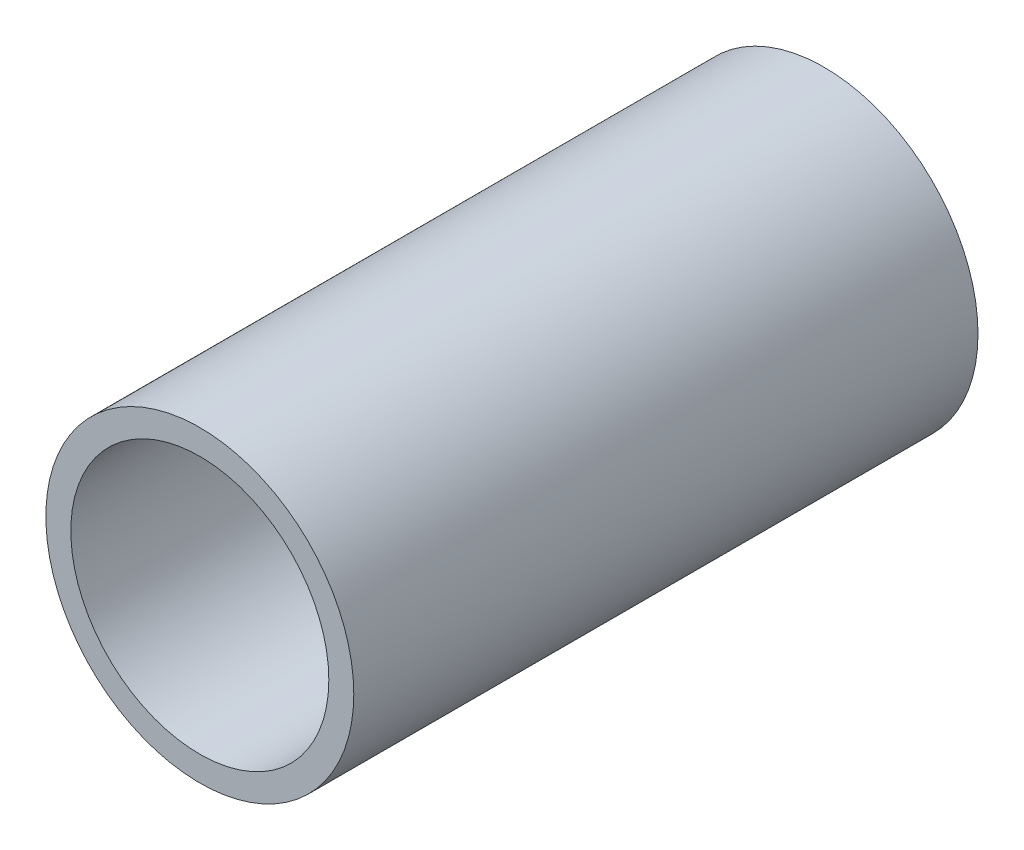
ISO-10303-21;
HEADER;
FILE_DESCRIPTION(('STEP AP214'),'2;1');
FILE_NAME('part.step','',(''),(''),'','','');
FILE_SCHEMA(('AUTOMOTIVE_DESIGN { 1 0 10303 214 1 1 1 1 }'));
ENDSEC;
DATA;
#1=APPLICATION_CONTEXT('core data for automotive mechanical design processes');
#2=APPLICATION_PROTOCOL_DEFINITION('international standard','automotive_design',2000,#1);
#3=PRODUCT_CONTEXT('',#1,'mechanical');
#4=PRODUCT('Part','Part','',(#3));
#5=PRODUCT_RELATED_PRODUCT_CATEGORY('part','',(#4));
#6=PRODUCT_DEFINITION_FORMATION('','',#4);
#7=PRODUCT_DEFINITION_CONTEXT('part definition',#1,'design');
#8=PRODUCT_DEFINITION('design','',#6,#7);
#9=PRODUCT_DEFINITION_SHAPE('','',#8);
#10=(LENGTH_UNIT() NAMED_UNIT(*) SI_UNIT(.MILLI.,.METRE.));
#11=(NAMED_UNIT(*) PLANE_ANGLE_UNIT() SI_UNIT($,.RADIAN.));
#12=(NAMED_UNIT(*) SI_UNIT($,.STERADIAN.) SOLID_ANGLE_UNIT());
#13=UNCERTAINTY_MEASURE_WITH_UNIT(LENGTH_MEASURE(1.E-05),#10,'distance_accuracy_value','');
#14=(GEOMETRIC_REPRESENTATION_CONTEXT(3) GLOBAL_UNCERTAINTY_ASSIGNED_CONTEXT((#13)) GLOBAL_UNIT_ASSIGNED_CONTEXT((#10,
#11,#12)) REPRESENTATION_CONTEXT('',''));
#15=CARTESIAN_POINT('',(0.,0.,0.));
#16=DIRECTION('',(0.,0.,1.));
#17=DIRECTION('',(1.,0.,0.));
#18=AXIS2_PLACEMENT_3D('',#15,#16,#17);
#19=CARTESIAN_POINT('',(0.,0.,15.));
#20=DIRECTION('',(0.,0.,1.));
#21=DIRECTION('',(1.,0.,0.));
#22=AXIS2_PLACEMENT_3D('',#19,#20,#21);
#23=PLANE('',#22);
#24=CARTESIAN_POINT('',(0.,0.,15.));
#25=DIRECTION('',(0.,0.,1.));
#26=DIRECTION('',(1.,0.,0.));
#27=AXIS2_PLACEMENT_3D('',#24,#25,#26);
#28=CIRCLE('',#27,3.7);
#29=CARTESIAN_POINT('',(3.7,0.,15.));
#30=VERTEX_POINT('',#29);
#31=EDGE_CURVE('E10',#30,#30,#28,.T.);
#32=ORIENTED_EDGE('',*,*,#31,.T.);
#33=EDGE_LOOP('',(#32));
#34=FACE_BOUND('',#33,.T.);
#35=CARTESIAN_POINT('',(0.,0.,15.));
#36=DIRECTION('',(0.,0.,1.));
#37=DIRECTION('',(1.,0.,0.));
#38=AXIS2_PLACEMENT_3D('',#35,#36,#37);
#39=CIRCLE('',#38,3.1);
#40=CARTESIAN_POINT('',(3.1,0.,15.));
#41=VERTEX_POINT('',#40);
#42=EDGE_CURVE('E46',#41,#41,#39,.T.);
#43=ORIENTED_EDGE('',*,*,#42,.F.);
#44=EDGE_LOOP('',(#43));
#45=FACE_BOUND('',#44,.T.);
#46=ADVANCED_FACE('F35',(#34,#45),#23,.T.);
#47=CARTESIAN_POINT('',(0.,0.,0.));
#48=DIRECTION('',(0.,0.,1.));
#49=DIRECTION('',(1.,0.,0.));
#50=AXIS2_PLACEMENT_3D('',#47,#48,#49);
#51=PLANE('',#50);
#52=CARTESIAN_POINT('',(0.,0.,0.));
#53=DIRECTION('',(0.,0.,1.));
#54=DIRECTION('',(1.,0.,0.));
#55=AXIS2_PLACEMENT_3D('',#52,#53,#54);
#56=CIRCLE('',#55,3.7);
#57=CARTESIAN_POINT('',(3.7,0.,0.));
#58=VERTEX_POINT('',#57);
#59=EDGE_CURVE('E39',#58,#58,#56,.T.);
#60=ORIENTED_EDGE('',*,*,#59,.F.);
#61=EDGE_LOOP('',(#60));
#62=FACE_BOUND('',#61,.T.);
#63=CARTESIAN_POINT('',(0.,0.,0.));
#64=DIRECTION('',(0.,0.,1.));
#65=DIRECTION('',(1.,0.,0.));
#66=AXIS2_PLACEMENT_3D('',#63,#64,#65);
#67=CIRCLE('',#66,3.1);
#68=CARTESIAN_POINT('',(3.1,0.,0.));
#69=VERTEX_POINT('',#68);
#70=EDGE_CURVE('E48',#69,#69,#67,.T.);
#71=ORIENTED_EDGE('',*,*,#70,.T.);
#72=EDGE_LOOP('',(#71));
#73=FACE_BOUND('',#72,.T.);
#74=ADVANCED_FACE('F58',(#62,#73),#51,.F.);
#75=CARTESIAN_POINT('',(0.,0.,15.));
#76=DIRECTION('',(0.,0.,-1.));
#77=DIRECTION('',(-1.,0.,0.));
#78=AXIS2_PLACEMENT_3D('',#75,#76,#77);
#79=CYLINDRICAL_SURFACE('',#78,3.7);
#80=ORIENTED_EDGE('',*,*,#31,.F.);
#81=EDGE_LOOP('',(#80));
#82=FACE_BOUND('',#81,.T.);
#83=ORIENTED_EDGE('',*,*,#59,.T.);
#84=EDGE_LOOP('',(#83));
#85=FACE_BOUND('',#84,.T.);
#86=ADVANCED_FACE('F37',(#82,#85),#79,.T.);
#87=CARTESIAN_POINT('',(0.,0.,15.));
#88=DIRECTION('',(0.,0.,-1.));
#89=DIRECTION('',(-1.,0.,0.));
#90=AXIS2_PLACEMENT_3D('',#87,#88,#89);
#91=CYLINDRICAL_SURFACE('',#90,3.1);
#92=ORIENTED_EDGE('',*,*,#42,.T.);
#93=EDGE_LOOP('',(#92));
#94=FACE_BOUND('',#93,.T.);
#95=ORIENTED_EDGE('',*,*,#70,.F.);
#96=EDGE_LOOP('',(#95));
#97=FACE_BOUND('',#96,.T.);
#98=ADVANCED_FACE('F54',(#94,#97),#91,.F.);
#99=CLOSED_SHELL('',(#46,#74,#86,#98));
#100=MANIFOLD_SOLID_BREP('B2',#99);
#101=ADVANCED_BREP_SHAPE_REPRESENTATION('',(#18,#100),#14);
#102=SHAPE_DEFINITION_REPRESENTATION(#9,#101);
ENDSEC;
END-ISO-10303-21;
